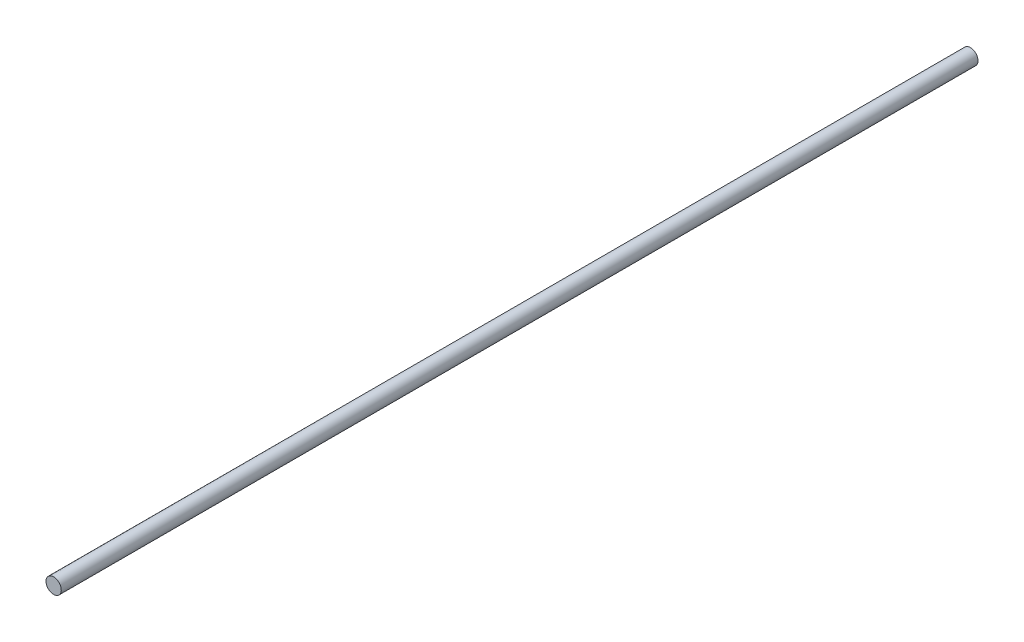
ISO-10303-21;
HEADER;
FILE_DESCRIPTION(('STEP AP214'),'2;1');
FILE_NAME('part.step','',(''),(''),'','','');
FILE_SCHEMA(('AUTOMOTIVE_DESIGN { 1 0 10303 214 1 1 1 1 }'));
ENDSEC;
DATA;
#1=APPLICATION_CONTEXT('core data for automotive mechanical design processes');
#2=APPLICATION_PROTOCOL_DEFINITION('international standard','automotive_design',2000,#1);
#3=PRODUCT_CONTEXT('',#1,'mechanical');
#4=PRODUCT('Part','Part','',(#3));
#5=PRODUCT_RELATED_PRODUCT_CATEGORY('part','',(#4));
#6=PRODUCT_DEFINITION_FORMATION('','',#4);
#7=PRODUCT_DEFINITION_CONTEXT('part definition',#1,'design');
#8=PRODUCT_DEFINITION('design','',#6,#7);
#9=PRODUCT_DEFINITION_SHAPE('','',#8);
#10=(LENGTH_UNIT() NAMED_UNIT(*) SI_UNIT(.MILLI.,.METRE.));
#11=(NAMED_UNIT(*) PLANE_ANGLE_UNIT() SI_UNIT($,.RADIAN.));
#12=(NAMED_UNIT(*) SI_UNIT($,.STERADIAN.) SOLID_ANGLE_UNIT());
#13=UNCERTAINTY_MEASURE_WITH_UNIT(LENGTH_MEASURE(1.E-05),#10,'distance_accuracy_value','');
#14=(GEOMETRIC_REPRESENTATION_CONTEXT(3) GLOBAL_UNCERTAINTY_ASSIGNED_CONTEXT((#13)) GLOBAL_UNIT_ASSIGNED_CONTEXT((#10,
#11,#12)) REPRESENTATION_CONTEXT('',''));
#15=CARTESIAN_POINT('',(0.,0.,0.));
#16=DIRECTION('',(0.,0.,1.));
#17=DIRECTION('',(1.,0.,0.));
#18=AXIS2_PLACEMENT_3D('',#15,#16,#17);
#19=CARTESIAN_POINT('',(0.,0.,300.));
#20=DIRECTION('',(0.,0.,-1.));
#21=DIRECTION('',(-1.,0.,0.));
#22=AXIS2_PLACEMENT_3D('',#19,#20,#21);
#23=CYLINDRICAL_SURFACE('',#22,5.);
#24=CARTESIAN_POINT('',(0.,0.,300.));
#25=DIRECTION('',(0.,0.,1.));
#26=DIRECTION('',(1.,0.,0.));
#27=AXIS2_PLACEMENT_3D('',#24,#25,#26);
#28=CIRCLE('',#27,5.);
#29=CARTESIAN_POINT('',(5.,0.,300.));
#30=VERTEX_POINT('',#29);
#31=EDGE_CURVE('E10',#30,#30,#28,.T.);
#32=ORIENTED_EDGE('',*,*,#31,.F.);
#33=EDGE_LOOP('',(#32));
#34=FACE_BOUND('',#33,.T.);
#35=CARTESIAN_POINT('',(0.,0.,-300.));
#36=DIRECTION('',(0.,0.,1.));
#37=DIRECTION('',(1.,0.,0.));
#38=AXIS2_PLACEMENT_3D('',#35,#36,#37);
#39=CIRCLE('',#38,5.);
#40=CARTESIAN_POINT('',(5.,0.,-300.));
#41=VERTEX_POINT('',#40);
#42=EDGE_CURVE('E44',#41,#41,#39,.T.);
#43=ORIENTED_EDGE('',*,*,#42,.T.);
#44=EDGE_LOOP('',(#43));
#45=FACE_BOUND('',#44,.T.);
#46=ADVANCED_FACE('F37',(#34,#45),#23,.T.);
#47=CARTESIAN_POINT('',(0.,0.,300.));
#48=DIRECTION('',(0.,0.,1.));
#49=DIRECTION('',(1.,0.,0.));
#50=AXIS2_PLACEMENT_3D('',#47,#48,#49);
#51=PLANE('',#50);
#52=ORIENTED_EDGE('',*,*,#31,.T.);
#53=EDGE_LOOP('',(#52));
#54=FACE_BOUND('',#53,.T.);
#55=ADVANCED_FACE('F54',(#54),#51,.T.);
#56=CARTESIAN_POINT('',(0.,0.,-300.));
#57=DIRECTION('',(0.,0.,1.));
#58=DIRECTION('',(1.,0.,0.));
#59=AXIS2_PLACEMENT_3D('',#56,#57,#58);
#60=PLANE('',#59);
#61=ORIENTED_EDGE('',*,*,#42,.F.);
#62=EDGE_LOOP('',(#61));
#63=FACE_BOUND('',#62,.T.);
#64=ADVANCED_FACE('F52',(#63),#60,.F.);
#65=CLOSED_SHELL('',(#46,#55,#64));
#66=MANIFOLD_SOLID_BREP('B2',#65);
#67=ADVANCED_BREP_SHAPE_REPRESENTATION('',(#18,#66),#14);
#68=SHAPE_DEFINITION_REPRESENTATION(#9,#67);
ENDSEC;
END-ISO-10303-21;
